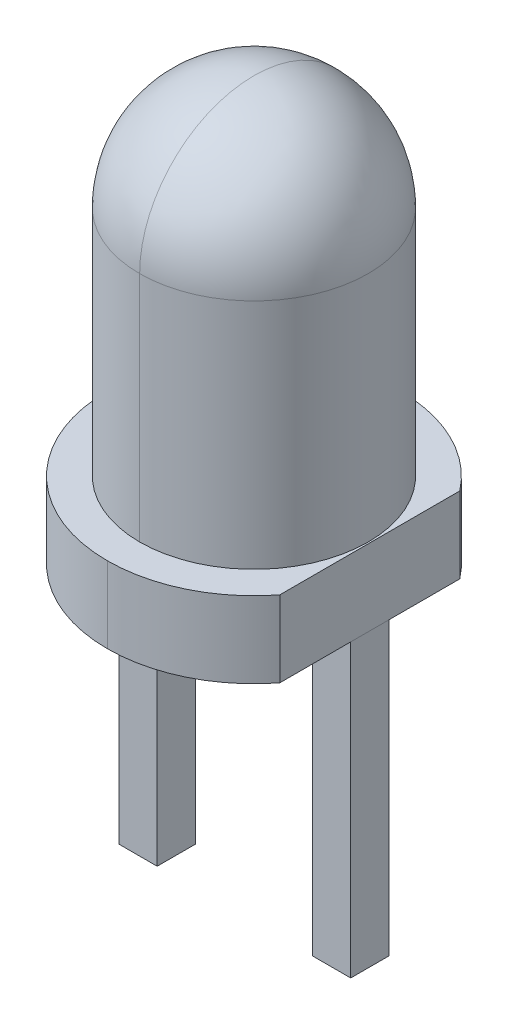
ISO-10303-21;
HEADER;
FILE_DESCRIPTION(('STEP AP214'),'2;1');
FILE_NAME('part.step','',(''),(''),'','','');
FILE_SCHEMA(('AUTOMOTIVE_DESIGN { 1 0 10303 214 1 1 1 1 }'));
ENDSEC;
DATA;
#1=APPLICATION_CONTEXT('core data for automotive mechanical design processes');
#2=APPLICATION_PROTOCOL_DEFINITION('international standard','automotive_design',2000,#1);
#3=PRODUCT_CONTEXT('',#1,'mechanical');
#4=PRODUCT('Part','Part','',(#3));
#5=PRODUCT_RELATED_PRODUCT_CATEGORY('part','',(#4));
#6=PRODUCT_DEFINITION_FORMATION('','',#4);
#7=PRODUCT_DEFINITION_CONTEXT('part definition',#1,'design');
#8=PRODUCT_DEFINITION('design','',#6,#7);
#9=PRODUCT_DEFINITION_SHAPE('','',#8);
#10=(LENGTH_UNIT() NAMED_UNIT(*) SI_UNIT(.MILLI.,.METRE.));
#11=(NAMED_UNIT(*) PLANE_ANGLE_UNIT() SI_UNIT($,.RADIAN.));
#12=(NAMED_UNIT(*) SI_UNIT($,.STERADIAN.) SOLID_ANGLE_UNIT());
#13=UNCERTAINTY_MEASURE_WITH_UNIT(LENGTH_MEASURE(1.E-05),#10,'distance_accuracy_value','');
#14=(GEOMETRIC_REPRESENTATION_CONTEXT(3) GLOBAL_UNCERTAINTY_ASSIGNED_CONTEXT((#13)) GLOBAL_UNIT_ASSIGNED_CONTEXT((#10,
#11,#12)) REPRESENTATION_CONTEXT('',''));
#15=CARTESIAN_POINT('',(0.,0.,0.));
#16=DIRECTION('',(0.,0.,1.));
#17=DIRECTION('',(1.,0.,0.));
#18=AXIS2_PLACEMENT_3D('',#15,#16,#17);
#19=CARTESIAN_POINT('',(0.,0.,-0.25));
#20=DIRECTION('',(0.,0.,1.));
#21=DIRECTION('',(1.,0.,0.));
#22=AXIS2_PLACEMENT_3D('',#19,#20,#21);
#23=PLANE('',#22);
#24=DIRECTION('',(0.,1.,0.));
#25=VECTOR('',#24,1.);
#26=CARTESIAN_POINT('',(-1.02,1.,-0.25));
#27=LINE('',#26,#25);
#28=CARTESIAN_POINT('',(-1.02,2.,-0.25));
#29=VERTEX_POINT('',#28);
#30=CARTESIAN_POINT('',(-1.02,5.82,-0.25));
#31=VERTEX_POINT('',#30);
#32=EDGE_CURVE('P0_E107',#29,#31,#27,.T.);
#33=ORIENTED_EDGE('',*,*,#32,.F.);
#34=DIRECTION('',(-1.,0.,0.));
#35=VECTOR('',#34,1.);
#36=CARTESIAN_POINT('',(0.,2.,-0.25));
#37=LINE('',#36,#35);
#38=CARTESIAN_POINT('',(-1.52,2.,-0.25));
#39=VERTEX_POINT('',#38);
#40=EDGE_CURVE('P0_E97',#29,#39,#37,.T.);
#41=ORIENTED_EDGE('',*,*,#40,.T.);
#42=DIRECTION('',(0.,-1.,0.));
#43=VECTOR('',#42,1.);
#44=CARTESIAN_POINT('',(-1.52,5.82,-0.25));
#45=LINE('',#44,#43);
#46=CARTESIAN_POINT('',(-1.52,5.82,-0.25));
#47=VERTEX_POINT('',#46);
#48=EDGE_CURVE('P0_E105',#47,#39,#45,.T.);
#49=ORIENTED_EDGE('',*,*,#48,.F.);
#50=DIRECTION('',(-1.,0.,0.));
#51=VECTOR('',#50,1.);
#52=CARTESIAN_POINT('',(-1.02,5.82,-0.25));
#53=LINE('',#52,#51);
#54=EDGE_CURVE('P0_E126',#31,#47,#53,.T.);
#55=ORIENTED_EDGE('',*,*,#54,.F.);
#56=EDGE_LOOP('',(#33,#41,#49,#55));
#57=FACE_BOUND('',#56,.T.);
#58=ADVANCED_FACE('P0_F54',(#57),#23,.F.);
#59=CARTESIAN_POINT('',(0.,0.,0.25));
#60=DIRECTION('',(0.,0.,1.));
#61=DIRECTION('',(1.,0.,0.));
#62=AXIS2_PLACEMENT_3D('',#59,#60,#61);
#63=PLANE('',#62);
#64=DIRECTION('',(-1.,0.,0.));
#65=VECTOR('',#64,1.);
#66=CARTESIAN_POINT('',(0.,2.,0.25));
#67=LINE('',#66,#65);
#68=CARTESIAN_POINT('',(-1.02,2.,0.25));
#69=VERTEX_POINT('',#68);
#70=CARTESIAN_POINT('',(-1.52,2.,0.25));
#71=VERTEX_POINT('',#70);
#72=EDGE_CURVE('P0_E68',#69,#71,#67,.T.);
#73=ORIENTED_EDGE('',*,*,#72,.F.);
#74=DIRECTION('',(0.,1.,0.));
#75=VECTOR('',#74,1.);
#76=CARTESIAN_POINT('',(-1.02,1.,0.25));
#77=LINE('',#76,#75);
#78=CARTESIAN_POINT('',(-1.02,5.82,0.25));
#79=VERTEX_POINT('',#78);
#80=EDGE_CURVE('P0_E61',#69,#79,#77,.T.);
#81=ORIENTED_EDGE('',*,*,#80,.T.);
#82=DIRECTION('',(-1.,0.,0.));
#83=VECTOR('',#82,1.);
#84=CARTESIAN_POINT('',(-1.02,5.82,0.25));
#85=LINE('',#84,#83);
#86=CARTESIAN_POINT('',(-1.52,5.82,0.25));
#87=VERTEX_POINT('',#86);
#88=EDGE_CURVE('P0_E123',#79,#87,#85,.T.);
#89=ORIENTED_EDGE('',*,*,#88,.T.);
#90=DIRECTION('',(0.,-1.,0.));
#91=VECTOR('',#90,1.);
#92=CARTESIAN_POINT('',(-1.52,5.82,0.25));
#93=LINE('',#92,#91);
#94=EDGE_CURVE('P0_E115',#87,#71,#93,.T.);
#95=ORIENTED_EDGE('',*,*,#94,.T.);
#96=EDGE_LOOP('',(#73,#81,#89,#95));
#97=FACE_BOUND('',#96,.T.);
#98=ADVANCED_FACE('P0_F139',(#97),#63,.T.);
#99=CARTESIAN_POINT('',(-1.02,1.,0.25));
#100=DIRECTION('',(-1.,0.,0.));
#101=DIRECTION('',(0.,1.,0.));
#102=AXIS2_PLACEMENT_3D('',#99,#100,#101);
#103=PLANE('',#102);
#104=ORIENTED_EDGE('',*,*,#80,.F.);
#105=DIRECTION('',(0.,0.,-1.));
#106=VECTOR('',#105,1.);
#107=CARTESIAN_POINT('',(-1.02,2.,0.25));
#108=LINE('',#107,#106);
#109=EDGE_CURVE('P0_E108',#69,#29,#108,.T.);
#110=ORIENTED_EDGE('',*,*,#109,.T.);
#111=ORIENTED_EDGE('',*,*,#32,.T.);
#112=DIRECTION('',(0.,0.,-1.));
#113=VECTOR('',#112,1.);
#114=CARTESIAN_POINT('',(-1.02,5.82,0.25));
#115=LINE('',#114,#113);
#116=EDGE_CURVE('P0_E116',#79,#31,#115,.T.);
#117=ORIENTED_EDGE('',*,*,#116,.F.);
#118=EDGE_LOOP('',(#104,#110,#111,#117));
#119=FACE_BOUND('',#118,.T.);
#120=ADVANCED_FACE('P0_F135',(#119),#103,.F.);
#121=CARTESIAN_POINT('',(-1.52,5.82,0.25));
#122=DIRECTION('',(1.,0.,0.));
#123=DIRECTION('',(0.,1.,0.));
#124=AXIS2_PLACEMENT_3D('',#121,#122,#123);
#125=PLANE('',#124);
#126=ORIENTED_EDGE('',*,*,#48,.T.);
#127=DIRECTION('',(0.,0.,1.));
#128=VECTOR('',#127,1.);
#129=CARTESIAN_POINT('',(-1.52,2.,0.25));
#130=LINE('',#129,#128);
#131=EDGE_CURVE('P0_E12',#39,#71,#130,.T.);
#132=ORIENTED_EDGE('',*,*,#131,.T.);
#133=ORIENTED_EDGE('',*,*,#94,.F.);
#134=DIRECTION('',(0.,0.,-1.));
#135=VECTOR('',#134,1.);
#136=CARTESIAN_POINT('',(-1.52,5.82,0.25));
#137=LINE('',#136,#135);
#138=EDGE_CURVE('P0_E112',#87,#47,#137,.T.);
#139=ORIENTED_EDGE('',*,*,#138,.T.);
#140=EDGE_LOOP('',(#126,#132,#133,#139));
#141=FACE_BOUND('',#140,.T.);
#142=ADVANCED_FACE('P0_F110',(#141),#125,.F.);
#143=CARTESIAN_POINT('',(-1.02,5.82,0.25));
#144=DIRECTION('',(0.,-1.,0.));
#145=DIRECTION('',(0.,0.,-1.));
#146=AXIS2_PLACEMENT_3D('',#143,#144,#145);
#147=PLANE('',#146);
#148=ORIENTED_EDGE('',*,*,#54,.T.);
#149=ORIENTED_EDGE('',*,*,#138,.F.);
#150=ORIENTED_EDGE('',*,*,#88,.F.);
#151=ORIENTED_EDGE('',*,*,#116,.T.);
#152=EDGE_LOOP('',(#148,#149,#150,#151));
#153=FACE_BOUND('',#152,.T.);
#154=ADVANCED_FACE('P0_F138',(#153),#147,.F.);
#155=CARTESIAN_POINT('',(0.,2.,0.));
#156=DIRECTION('',(0.,1.,0.));
#157=DIRECTION('',(0.,0.,1.));
#158=AXIS2_PLACEMENT_3D('',#155,#156,#157);
#159=PLANE('',#158);
#160=ORIENTED_EDGE('',*,*,#72,.T.);
#161=ORIENTED_EDGE('',*,*,#131,.F.);
#162=ORIENTED_EDGE('',*,*,#40,.F.);
#163=ORIENTED_EDGE('',*,*,#109,.F.);
#164=EDGE_LOOP('',(#160,#161,#162,#163));
#165=FACE_BOUND('',#164,.T.);
#166=ADVANCED_FACE('P0_F96',(#165),#159,.F.);
#167=CLOSED_SHELL('',(#58,#98,#120,#142,#154,#166));
#168=MANIFOLD_SOLID_BREP('P0_B2',#167);
#169=CARTESIAN_POINT('',(0.,0.,-0.25));
#170=DIRECTION('',(0.,0.,-1.));
#171=DIRECTION('',(0.,-1.,0.));
#172=AXIS2_PLACEMENT_3D('',#169,#170,#171);
#173=PLANE('',#172);
#174=DIRECTION('',(1.,0.,0.));
#175=VECTOR('',#174,1.);
#176=CARTESIAN_POINT('',(0.,2.,-0.25));
#177=LINE('',#176,#175);
#178=CARTESIAN_POINT('',(1.02,2.,-0.25));
#179=VERTEX_POINT('',#178);
#180=CARTESIAN_POINT('',(1.52,2.,-0.25));
#181=VERTEX_POINT('',#180);
#182=EDGE_CURVE('P0_E285',#179,#181,#177,.T.);
#183=ORIENTED_EDGE('',*,*,#182,.F.);
#184=DIRECTION('',(0.,-1.,0.));
#185=VECTOR('',#184,1.);
#186=CARTESIAN_POINT('',(1.02,1.,-0.25));
#187=LINE('',#186,#185);
#188=CARTESIAN_POINT('',(1.02,5.82,-0.25));
#189=VERTEX_POINT('',#188);
#190=EDGE_CURVE('P0_E269',#189,#179,#187,.T.);
#191=ORIENTED_EDGE('',*,*,#190,.F.);
#192=DIRECTION('',(-1.,0.,0.));
#193=VECTOR('',#192,1.);
#194=CARTESIAN_POINT('',(1.02,5.82,-0.25));
#195=LINE('',#194,#193);
#196=CARTESIAN_POINT('',(1.52,5.82,-0.25));
#197=VERTEX_POINT('',#196);
#198=EDGE_CURVE('P0_E256',#197,#189,#195,.T.);
#199=ORIENTED_EDGE('',*,*,#198,.F.);
#200=DIRECTION('',(0.,1.,0.));
#201=VECTOR('',#200,1.);
#202=CARTESIAN_POINT('',(1.52,5.82,-0.25));
#203=LINE('',#202,#201);
#204=EDGE_CURVE('P0_E265',#181,#197,#203,.T.);
#205=ORIENTED_EDGE('',*,*,#204,.F.);
#206=EDGE_LOOP('',(#183,#191,#199,#205));
#207=FACE_BOUND('',#206,.T.);
#208=ADVANCED_FACE('P0_F207',(#207),#173,.T.);
#209=CARTESIAN_POINT('',(0.,0.,0.25));
#210=DIRECTION('',(0.,0.,-1.));
#211=DIRECTION('',(0.,-1.,0.));
#212=AXIS2_PLACEMENT_3D('',#209,#210,#211);
#213=PLANE('',#212);
#214=DIRECTION('',(0.,-1.,0.));
#215=VECTOR('',#214,1.);
#216=CARTESIAN_POINT('',(1.02,1.,0.25));
#217=LINE('',#216,#215);
#218=CARTESIAN_POINT('',(1.02,5.82,0.25));
#219=VERTEX_POINT('',#218);
#220=CARTESIAN_POINT('',(1.02,2.,0.25));
#221=VERTEX_POINT('',#220);
#222=EDGE_CURVE('P0_E251',#219,#221,#217,.T.);
#223=ORIENTED_EDGE('',*,*,#222,.T.);
#224=DIRECTION('',(1.,0.,0.));
#225=VECTOR('',#224,1.);
#226=CARTESIAN_POINT('',(0.,2.,0.25));
#227=LINE('',#226,#225);
#228=CARTESIAN_POINT('',(1.52,2.,0.25));
#229=VERTEX_POINT('',#228);
#230=EDGE_CURVE('P0_E222',#221,#229,#227,.T.);
#231=ORIENTED_EDGE('',*,*,#230,.T.);
#232=DIRECTION('',(0.,1.,0.));
#233=VECTOR('',#232,1.);
#234=CARTESIAN_POINT('',(1.52,5.82,0.25));
#235=LINE('',#234,#233);
#236=CARTESIAN_POINT('',(1.52,5.82,0.25));
#237=VERTEX_POINT('',#236);
#238=EDGE_CURVE('P0_E233',#229,#237,#235,.T.);
#239=ORIENTED_EDGE('',*,*,#238,.T.);
#240=DIRECTION('',(-1.,0.,0.));
#241=VECTOR('',#240,1.);
#242=CARTESIAN_POINT('',(1.02,5.82,0.25));
#243=LINE('',#242,#241);
#244=EDGE_CURVE('P0_E215',#237,#219,#243,.T.);
#245=ORIENTED_EDGE('',*,*,#244,.T.);
#246=EDGE_LOOP('',(#223,#231,#239,#245));
#247=FACE_BOUND('',#246,.T.);
#248=ADVANCED_FACE('P0_F249',(#247),#213,.F.);
#249=CARTESIAN_POINT('',(1.02,5.82,0.25));
#250=DIRECTION('',(0.,-1.,0.));
#251=DIRECTION('',(0.,0.,-1.));
#252=AXIS2_PLACEMENT_3D('',#249,#250,#251);
#253=PLANE('',#252);
#254=ORIENTED_EDGE('',*,*,#198,.T.);
#255=DIRECTION('',(0.,0.,-1.));
#256=VECTOR('',#255,1.);
#257=CARTESIAN_POINT('',(1.02,5.82,0.25));
#258=LINE('',#257,#256);
#259=EDGE_CURVE('P0_E259',#219,#189,#258,.T.);
#260=ORIENTED_EDGE('',*,*,#259,.F.);
#261=ORIENTED_EDGE('',*,*,#244,.F.);
#262=DIRECTION('',(0.,0.,-1.));
#263=VECTOR('',#262,1.);
#264=CARTESIAN_POINT('',(1.52,5.82,0.25));
#265=LINE('',#264,#263);
#266=EDGE_CURVE('P0_E277',#237,#197,#265,.T.);
#267=ORIENTED_EDGE('',*,*,#266,.T.);
#268=EDGE_LOOP('',(#254,#260,#261,#267));
#269=FACE_BOUND('',#268,.T.);
#270=ADVANCED_FACE('P0_F209',(#269),#253,.F.);
#271=CARTESIAN_POINT('',(1.52,5.82,0.25));
#272=DIRECTION('',(-1.,0.,0.));
#273=DIRECTION('',(0.,0.,1.));
#274=AXIS2_PLACEMENT_3D('',#271,#272,#273);
#275=PLANE('',#274);
#276=ORIENTED_EDGE('',*,*,#238,.F.);
#277=DIRECTION('',(0.,0.,-1.));
#278=VECTOR('',#277,1.);
#279=CARTESIAN_POINT('',(1.52,2.,0.25));
#280=LINE('',#279,#278);
#281=EDGE_CURVE('P0_E274',#229,#181,#280,.T.);
#282=ORIENTED_EDGE('',*,*,#281,.T.);
#283=ORIENTED_EDGE('',*,*,#204,.T.);
#284=ORIENTED_EDGE('',*,*,#266,.F.);
#285=EDGE_LOOP('',(#276,#282,#283,#284));
#286=FACE_BOUND('',#285,.T.);
#287=ADVANCED_FACE('P0_F291',(#286),#275,.F.);
#288=CARTESIAN_POINT('',(1.02,1.,0.25));
#289=DIRECTION('',(1.,0.,0.));
#290=DIRECTION('',(0.,-1.,0.));
#291=AXIS2_PLACEMENT_3D('',#288,#289,#290);
#292=PLANE('',#291);
#293=ORIENTED_EDGE('',*,*,#190,.T.);
#294=DIRECTION('',(0.,0.,1.));
#295=VECTOR('',#294,1.);
#296=CARTESIAN_POINT('',(1.02,2.,0.25));
#297=LINE('',#296,#295);
#298=EDGE_CURVE('P0_E52',#179,#221,#297,.T.);
#299=ORIENTED_EDGE('',*,*,#298,.T.);
#300=ORIENTED_EDGE('',*,*,#222,.F.);
#301=ORIENTED_EDGE('',*,*,#259,.T.);
#302=EDGE_LOOP('',(#293,#299,#300,#301));
#303=FACE_BOUND('',#302,.T.);
#304=ADVANCED_FACE('P0_F267',(#303),#292,.F.);
#305=CARTESIAN_POINT('',(0.,2.,0.));
#306=DIRECTION('',(0.,1.,0.));
#307=DIRECTION('',(0.,0.,1.));
#308=AXIS2_PLACEMENT_3D('',#305,#306,#307);
#309=PLANE('',#308);
#310=ORIENTED_EDGE('',*,*,#230,.F.);
#311=ORIENTED_EDGE('',*,*,#298,.F.);
#312=ORIENTED_EDGE('',*,*,#182,.T.);
#313=ORIENTED_EDGE('',*,*,#281,.F.);
#314=EDGE_LOOP('',(#310,#311,#312,#313));
#315=FACE_BOUND('',#314,.T.);
#316=ADVANCED_FACE('P0_F296',(#315),#309,.F.);
#317=CLOSED_SHELL('',(#208,#248,#270,#287,#304,#316));
#318=MANIFOLD_SOLID_BREP('P0_B6',#317);
#319=CARTESIAN_POINT('',(0.,9.87,0.));
#320=DIRECTION('',(1.,0.,0.));
#321=DIRECTION('',(0.,0.,1.));
#322=AXIS2_PLACEMENT_3D('',#319,#320,#321);
#323=SPHERICAL_SURFACE('',#322,1.5);
#324=CARTESIAN_POINT('',(0.,9.87,0.));
#325=DIRECTION('',(1.,0.,0.));
#326=DIRECTION('',(0.,0.,-1.));
#327=AXIS2_PLACEMENT_3D('',#324,#325,#326);
#328=CIRCLE('',#327,1.5);
#329=CARTESIAN_POINT('',(0.,9.87,-1.5));
#330=VERTEX_POINT('',#329);
#331=CARTESIAN_POINT('',(0.,11.37,0.));
#332=VERTEX_POINT('',#331);
#333=EDGE_CURVE('P1_E123',#330,#332,#328,.T.);
#334=ORIENTED_EDGE('',*,*,#333,.F.);
#335=CARTESIAN_POINT('',(0.,9.87,0.));
#336=DIRECTION('',(0.,-1.,0.));
#337=DIRECTION('',(0.,0.,-1.));
#338=AXIS2_PLACEMENT_3D('',#335,#336,#337);
#339=CIRCLE('',#338,1.5);
#340=CARTESIAN_POINT('',(0.,9.87,1.5));
#341=VERTEX_POINT('',#340);
#342=EDGE_CURVE('P1_E11',#341,#330,#339,.T.);
#343=ORIENTED_EDGE('',*,*,#342,.F.);
#344=CARTESIAN_POINT('',(0.,9.87,0.));
#345=DIRECTION('',(-1.,0.,0.));
#346=DIRECTION('',(0.,0.,1.));
#347=AXIS2_PLACEMENT_3D('',#344,#345,#346);
#348=CIRCLE('',#347,1.5);
#349=EDGE_CURVE('P1_E124',#341,#332,#348,.T.);
#350=ORIENTED_EDGE('',*,*,#349,.T.);
#351=EDGE_LOOP('',(#334,#343,#350));
#352=FACE_BOUND('',#351,.T.);
#353=ADVANCED_FACE('P1_F16',(#352),#323,.T.);
#354=CARTESIAN_POINT('',(0.,21.1626406871193,0.));
#355=DIRECTION('',(0.,-1.,0.));
#356=DIRECTION('',(0.,0.,-1.));
#357=AXIS2_PLACEMENT_3D('',#354,#355,#356);
#358=CYLINDRICAL_SURFACE('',#357,1.5);
#359=DIRECTION('',(0.,-1.,0.));
#360=VECTOR('',#359,1.);
#361=CARTESIAN_POINT('',(0.,21.1626406871193,1.5));
#362=LINE('',#361,#360);
#363=CARTESIAN_POINT('',(0.,6.82,1.5));
#364=VERTEX_POINT('',#363);
#365=EDGE_CURVE('P1_E20',#341,#364,#362,.T.);
#366=ORIENTED_EDGE('',*,*,#365,.F.);
#367=ORIENTED_EDGE('',*,*,#342,.T.);
#368=DIRECTION('',(0.,-1.,0.));
#369=VECTOR('',#368,1.);
#370=CARTESIAN_POINT('',(0.,21.1626406871193,-1.5));
#371=LINE('',#370,#369);
#372=CARTESIAN_POINT('',(0.,6.82,-1.5));
#373=VERTEX_POINT('',#372);
#374=EDGE_CURVE('P1_E107',#330,#373,#371,.T.);
#375=ORIENTED_EDGE('',*,*,#374,.T.);
#376=CARTESIAN_POINT('',(0.,6.82,0.));
#377=DIRECTION('',(0.,1.,0.));
#378=DIRECTION('',(0.,0.,1.));
#379=AXIS2_PLACEMENT_3D('',#376,#377,#378);
#380=CIRCLE('',#379,1.5);
#381=EDGE_CURVE('P1_E27',#373,#364,#380,.T.);
#382=ORIENTED_EDGE('',*,*,#381,.T.);
#383=EDGE_LOOP('',(#366,#367,#375,#382));
#384=FACE_BOUND('',#383,.T.);
#385=ADVANCED_FACE('P1_F18',(#384),#358,.T.);
#386=CARTESIAN_POINT('',(0.,5.82,0.));
#387=DIRECTION('',(0.,1.,0.));
#388=DIRECTION('',(1.,0.,0.));
#389=AXIS2_PLACEMENT_3D('',#386,#387,#388);
#390=PLANE('',#389);
#391=CARTESIAN_POINT('',(0.,5.82,0.));
#392=DIRECTION('',(0.,1.,0.));
#393=DIRECTION('',(0.,0.,1.));
#394=AXIS2_PLACEMENT_3D('',#391,#392,#393);
#395=CIRCLE('',#394,1.925);
#396=CARTESIAN_POINT('',(1.52,5.82,-1.1811964273566));
#397=VERTEX_POINT('',#396);
#398=CARTESIAN_POINT('',(0.,5.82,-1.925));
#399=VERTEX_POINT('',#398);
#400=EDGE_CURVE('P1_E154',#397,#399,#395,.T.);
#401=ORIENTED_EDGE('',*,*,#400,.F.);
#402=DIRECTION('',(0.,0.,-1.));
#403=VECTOR('',#402,1.);
#404=CARTESIAN_POINT('',(1.52,5.82,-1.1811964273566));
#405=LINE('',#404,#403);
#406=CARTESIAN_POINT('',(1.52,5.82,1.1811964273566));
#407=VERTEX_POINT('',#406);
#408=EDGE_CURVE('P1_E41',#407,#397,#405,.T.);
#409=ORIENTED_EDGE('',*,*,#408,.F.);
#410=CARTESIAN_POINT('',(0.,5.82,0.));
#411=DIRECTION('',(0.,1.,0.));
#412=DIRECTION('',(0.,0.,1.));
#413=AXIS2_PLACEMENT_3D('',#410,#411,#412);
#414=CIRCLE('',#413,1.925);
#415=CARTESIAN_POINT('',(0.,5.82,1.925));
#416=VERTEX_POINT('',#415);
#417=EDGE_CURVE('P1_E137',#416,#407,#414,.T.);
#418=ORIENTED_EDGE('',*,*,#417,.F.);
#419=CARTESIAN_POINT('',(0.,5.82,0.));
#420=DIRECTION('',(0.,1.,0.));
#421=DIRECTION('',(0.,0.,1.));
#422=AXIS2_PLACEMENT_3D('',#419,#420,#421);
#423=CIRCLE('',#422,1.925);
#424=EDGE_CURVE('P1_E98',#399,#416,#423,.T.);
#425=ORIENTED_EDGE('',*,*,#424,.F.);
#426=EDGE_LOOP('',(#401,#409,#418,#425));
#427=FACE_BOUND('',#426,.T.);
#428=ADVANCED_FACE('P1_F208',(#427),#390,.F.);
#429=CARTESIAN_POINT('',(0.,6.82,0.));
#430=DIRECTION('',(0.,1.,0.));
#431=DIRECTION('',(1.,0.,0.));
#432=AXIS2_PLACEMENT_3D('',#429,#430,#431);
#433=PLANE('',#432);
#434=ORIENTED_EDGE('',*,*,#381,.F.);
#435=CARTESIAN_POINT('',(0.,6.82,0.));
#436=DIRECTION('',(0.,1.,0.));
#437=DIRECTION('',(0.,0.,1.));
#438=AXIS2_PLACEMENT_3D('',#435,#436,#437);
#439=CIRCLE('',#438,1.5);
#440=EDGE_CURVE('P1_E118',#364,#373,#439,.T.);
#441=ORIENTED_EDGE('',*,*,#440,.F.);
#442=EDGE_LOOP('',(#434,#441));
#443=FACE_BOUND('',#442,.T.);
#444=CARTESIAN_POINT('',(0.,6.82,0.));
#445=DIRECTION('',(0.,1.,0.));
#446=DIRECTION('',(0.,0.,1.));
#447=AXIS2_PLACEMENT_3D('',#444,#445,#446);
#448=CIRCLE('',#447,1.925);
#449=CARTESIAN_POINT('',(1.52,6.82,-1.1811964273566));
#450=VERTEX_POINT('',#449);
#451=CARTESIAN_POINT('',(0.,6.82,-1.925));
#452=VERTEX_POINT('',#451);
#453=EDGE_CURVE('P1_E155',#450,#452,#448,.T.);
#454=ORIENTED_EDGE('',*,*,#453,.T.);
#455=CARTESIAN_POINT('',(0.,6.82,0.));
#456=DIRECTION('',(0.,1.,0.));
#457=DIRECTION('',(0.,0.,1.));
#458=AXIS2_PLACEMENT_3D('',#455,#456,#457);
#459=CIRCLE('',#458,1.925);
#460=CARTESIAN_POINT('',(0.,6.82,1.925));
#461=VERTEX_POINT('',#460);
#462=EDGE_CURVE('P1_E145',#452,#461,#459,.T.);
#463=ORIENTED_EDGE('',*,*,#462,.T.);
#464=CARTESIAN_POINT('',(0.,6.82,0.));
#465=DIRECTION('',(0.,1.,0.));
#466=DIRECTION('',(0.,0.,1.));
#467=AXIS2_PLACEMENT_3D('',#464,#465,#466);
#468=CIRCLE('',#467,1.925);
#469=CARTESIAN_POINT('',(1.52,6.82,1.1811964273566));
#470=VERTEX_POINT('',#469);
#471=EDGE_CURVE('P1_E120',#461,#470,#468,.T.);
#472=ORIENTED_EDGE('',*,*,#471,.T.);
#473=DIRECTION('',(0.,0.,-1.));
#474=VECTOR('',#473,1.);
#475=CARTESIAN_POINT('',(1.52,6.82,-1.1811964273566));
#476=LINE('',#475,#474);
#477=EDGE_CURVE('P1_E86',#470,#450,#476,.T.);
#478=ORIENTED_EDGE('',*,*,#477,.T.);
#479=EDGE_LOOP('',(#454,#463,#472,#478));
#480=FACE_BOUND('',#479,.T.);
#481=ADVANCED_FACE('P1_F212',(#443,#480),#433,.T.);
#482=CARTESIAN_POINT('',(1.52,6.82,-1.1811964273566));
#483=DIRECTION('',(-1.,0.,0.));
#484=DIRECTION('',(0.,0.,1.));
#485=AXIS2_PLACEMENT_3D('',#482,#483,#484);
#486=PLANE('',#485);
#487=ORIENTED_EDGE('',*,*,#408,.T.);
#488=DIRECTION('',(0.,-1.,0.));
#489=VECTOR('',#488,1.);
#490=CARTESIAN_POINT('',(1.52,6.82,-1.1811964273566));
#491=LINE('',#490,#489);
#492=EDGE_CURVE('P1_E150',#450,#397,#491,.T.);
#493=ORIENTED_EDGE('',*,*,#492,.F.);
#494=ORIENTED_EDGE('',*,*,#477,.F.);
#495=DIRECTION('',(0.,-1.,0.));
#496=VECTOR('',#495,1.);
#497=CARTESIAN_POINT('',(1.52,6.82,1.1811964273566));
#498=LINE('',#497,#496);
#499=EDGE_CURVE('P1_E148',#470,#407,#498,.T.);
#500=ORIENTED_EDGE('',*,*,#499,.T.);
#501=EDGE_LOOP('',(#487,#493,#494,#500));
#502=FACE_BOUND('',#501,.T.);
#503=ADVANCED_FACE('P1_F233',(#502),#486,.F.);
#504=CARTESIAN_POINT('',(0.,6.82,0.));
#505=DIRECTION('',(0.,-1.,0.));
#506=DIRECTION('',(0.,0.,-1.));
#507=AXIS2_PLACEMENT_3D('',#504,#505,#506);
#508=CYLINDRICAL_SURFACE('',#507,1.925);
#509=DIRECTION('',(0.,-1.,0.));
#510=VECTOR('',#509,1.);
#511=CARTESIAN_POINT('',(0.,6.82,-1.925));
#512=LINE('',#511,#510);
#513=EDGE_CURVE('P1_E147',#452,#399,#512,.T.);
#514=ORIENTED_EDGE('',*,*,#513,.F.);
#515=ORIENTED_EDGE('',*,*,#453,.F.);
#516=ORIENTED_EDGE('',*,*,#492,.T.);
#517=ORIENTED_EDGE('',*,*,#400,.T.);
#518=EDGE_LOOP('',(#514,#515,#516,#517));
#519=FACE_BOUND('',#518,.T.);
#520=ADVANCED_FACE('P1_F223',(#519),#508,.T.);
#521=CARTESIAN_POINT('',(0.,6.82,0.));
#522=DIRECTION('',(0.,-1.,0.));
#523=DIRECTION('',(0.,0.,-1.));
#524=AXIS2_PLACEMENT_3D('',#521,#522,#523);
#525=CYLINDRICAL_SURFACE('',#524,1.925);
#526=DIRECTION('',(0.,-1.,0.));
#527=VECTOR('',#526,1.);
#528=CARTESIAN_POINT('',(0.,6.82,1.925));
#529=LINE('',#528,#527);
#530=EDGE_CURVE('P1_E139',#461,#416,#529,.T.);
#531=ORIENTED_EDGE('',*,*,#530,.F.);
#532=ORIENTED_EDGE('',*,*,#462,.F.);
#533=ORIENTED_EDGE('',*,*,#513,.T.);
#534=ORIENTED_EDGE('',*,*,#424,.T.);
#535=EDGE_LOOP('',(#531,#532,#533,#534));
#536=FACE_BOUND('',#535,.T.);
#537=ADVANCED_FACE('P1_F190',(#536),#525,.T.);
#538=CARTESIAN_POINT('',(0.,6.82,0.));
#539=DIRECTION('',(0.,-1.,0.));
#540=DIRECTION('',(0.,0.,-1.));
#541=AXIS2_PLACEMENT_3D('',#538,#539,#540);
#542=CYLINDRICAL_SURFACE('',#541,1.925);
#543=ORIENTED_EDGE('',*,*,#471,.F.);
#544=ORIENTED_EDGE('',*,*,#530,.T.);
#545=ORIENTED_EDGE('',*,*,#417,.T.);
#546=ORIENTED_EDGE('',*,*,#499,.F.);
#547=EDGE_LOOP('',(#543,#544,#545,#546));
#548=FACE_BOUND('',#547,.T.);
#549=ADVANCED_FACE('P1_F185',(#548),#542,.T.);
#550=CARTESIAN_POINT('',(0.,21.1626406871193,0.));
#551=DIRECTION('',(0.,-1.,0.));
#552=DIRECTION('',(0.,0.,-1.));
#553=AXIS2_PLACEMENT_3D('',#550,#551,#552);
#554=CYLINDRICAL_SURFACE('',#553,1.5);
#555=CARTESIAN_POINT('',(0.,9.87,0.));
#556=DIRECTION('',(0.,-1.,0.));
#557=DIRECTION('',(0.,0.,-1.));
#558=AXIS2_PLACEMENT_3D('',#555,#556,#557);
#559=CIRCLE('',#558,1.5);
#560=EDGE_CURVE('P1_E117',#330,#341,#559,.T.);
#561=ORIENTED_EDGE('',*,*,#560,.T.);
#562=ORIENTED_EDGE('',*,*,#365,.T.);
#563=ORIENTED_EDGE('',*,*,#440,.T.);
#564=ORIENTED_EDGE('',*,*,#374,.F.);
#565=EDGE_LOOP('',(#561,#562,#563,#564));
#566=FACE_BOUND('',#565,.T.);
#567=ADVANCED_FACE('P1_F115',(#566),#554,.T.);
#568=CARTESIAN_POINT('',(0.,9.87,0.));
#569=DIRECTION('',(1.,0.,0.));
#570=DIRECTION('',(0.,0.,1.));
#571=AXIS2_PLACEMENT_3D('',#568,#569,#570);
#572=SPHERICAL_SURFACE('',#571,1.5);
#573=ORIENTED_EDGE('',*,*,#560,.F.);
#574=ORIENTED_EDGE('',*,*,#333,.T.);
#575=ORIENTED_EDGE('',*,*,#349,.F.);
#576=EDGE_LOOP('',(#573,#574,#575));
#577=FACE_BOUND('',#576,.T.);
#578=ADVANCED_FACE('P1_F128',(#577),#572,.T.);
#579=CLOSED_SHELL('',(#353,#385,#428,#481,#503,#520,#537,#549,#567,#578));
#580=MANIFOLD_SOLID_BREP('P1_B1',#579);
#581=ADVANCED_BREP_SHAPE_REPRESENTATION('',(#18,#168,#318,#580),#14);
#582=SHAPE_DEFINITION_REPRESENTATION(#9,#581);
ENDSEC;
END-ISO-10303-21;
